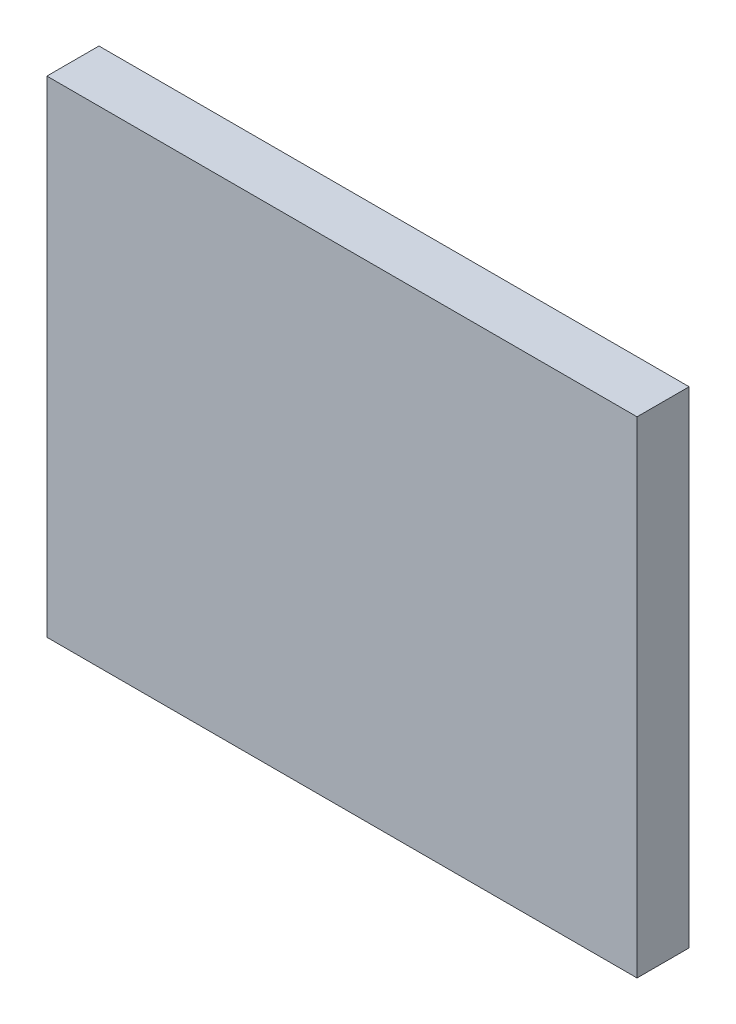
ISO-10303-21;
HEADER;
FILE_DESCRIPTION(('STEP AP214'),'2;1');
FILE_NAME('part.step','',(''),(''),'','','');
FILE_SCHEMA(('AUTOMOTIVE_DESIGN { 1 0 10303 214 1 1 1 1 }'));
ENDSEC;
DATA;
#1=APPLICATION_CONTEXT('core data for automotive mechanical design processes');
#2=APPLICATION_PROTOCOL_DEFINITION('international standard','automotive_design',2000,#1);
#3=PRODUCT_CONTEXT('',#1,'mechanical');
#4=PRODUCT('Part','Part','',(#3));
#5=PRODUCT_RELATED_PRODUCT_CATEGORY('part','',(#4));
#6=PRODUCT_DEFINITION_FORMATION('','',#4);
#7=PRODUCT_DEFINITION_CONTEXT('part definition',#1,'design');
#8=PRODUCT_DEFINITION('design','',#6,#7);
#9=PRODUCT_DEFINITION_SHAPE('','',#8);
#10=(LENGTH_UNIT() NAMED_UNIT(*) SI_UNIT(.MILLI.,.METRE.));
#11=(NAMED_UNIT(*) PLANE_ANGLE_UNIT() SI_UNIT($,.RADIAN.));
#12=(NAMED_UNIT(*) SI_UNIT($,.STERADIAN.) SOLID_ANGLE_UNIT());
#13=UNCERTAINTY_MEASURE_WITH_UNIT(LENGTH_MEASURE(1.E-05),#10,'distance_accuracy_value','');
#14=(GEOMETRIC_REPRESENTATION_CONTEXT(3) GLOBAL_UNCERTAINTY_ASSIGNED_CONTEXT((#13)) GLOBAL_UNIT_ASSIGNED_CONTEXT((#10,
#11,#12)) REPRESENTATION_CONTEXT('',''));
#15=CARTESIAN_POINT('',(0.,0.,0.));
#16=DIRECTION('',(0.,0.,1.));
#17=DIRECTION('',(1.,0.,0.));
#18=AXIS2_PLACEMENT_3D('',#15,#16,#17);
#19=CARTESIAN_POINT('',(10.,-1.4,0.3));
#20=DIRECTION('',(0.,0.,1.));
#21=DIRECTION('',(1.,0.,0.));
#22=AXIS2_PLACEMENT_3D('',#19,#20,#21);
#23=PLANE('',#22);
#24=DIRECTION('',(0.,1.,0.));
#25=VECTOR('',#24,1.);
#26=CARTESIAN_POINT('',(13.4,-1.4,0.3));
#27=LINE('',#26,#25);
#28=CARTESIAN_POINT('',(13.4,1.4,0.3));
#29=VERTEX_POINT('',#28);
#30=CARTESIAN_POINT('',(13.4,-1.4,0.3));
#31=VERTEX_POINT('',#30);
#32=EDGE_CURVE('E76',#29,#31,#27,.F.);
#33=ORIENTED_EDGE('',*,*,#32,.F.);
#34=DIRECTION('',(1.,0.,0.));
#35=VECTOR('',#34,1.);
#36=CARTESIAN_POINT('',(10.,1.4,0.3));
#37=LINE('',#36,#35);
#38=CARTESIAN_POINT('',(10.,1.4,0.3));
#39=VERTEX_POINT('',#38);
#40=EDGE_CURVE('E58',#39,#29,#37,.T.);
#41=ORIENTED_EDGE('',*,*,#40,.F.);
#42=DIRECTION('',(0.,1.,0.));
#43=VECTOR('',#42,1.);
#44=CARTESIAN_POINT('',(10.,-1.4,0.3));
#45=LINE('',#44,#43);
#46=CARTESIAN_POINT('',(10.,-1.4,0.3));
#47=VERTEX_POINT('',#46);
#48=EDGE_CURVE('E20',#39,#47,#45,.F.);
#49=ORIENTED_EDGE('',*,*,#48,.T.);
#50=DIRECTION('',(1.,0.,0.));
#51=VECTOR('',#50,1.);
#52=CARTESIAN_POINT('',(10.,-1.4,0.3));
#53=LINE('',#52,#51);
#54=EDGE_CURVE('E55',#47,#31,#53,.T.);
#55=ORIENTED_EDGE('',*,*,#54,.T.);
#56=EDGE_LOOP('',(#33,#41,#49,#55));
#57=FACE_BOUND('',#56,.T.);
#58=ADVANCED_FACE('F17',(#57),#23,.T.);
#59=CARTESIAN_POINT('',(10.,-1.4,0.));
#60=DIRECTION('',(1.,0.,0.));
#61=DIRECTION('',(0.,0.,-1.));
#62=AXIS2_PLACEMENT_3D('',#59,#60,#61);
#63=PLANE('',#62);
#64=DIRECTION('',(0.,0.,1.));
#65=VECTOR('',#64,1.);
#66=CARTESIAN_POINT('',(10.,1.4,0.));
#67=LINE('',#66,#65);
#68=CARTESIAN_POINT('',(10.,1.4,0.));
#69=VERTEX_POINT('',#68);
#70=EDGE_CURVE('E78',#69,#39,#67,.T.);
#71=ORIENTED_EDGE('',*,*,#70,.F.);
#72=DIRECTION('',(0.,1.,0.));
#73=VECTOR('',#72,1.);
#74=CARTESIAN_POINT('',(10.,-1.4,0.));
#75=LINE('',#74,#73);
#76=CARTESIAN_POINT('',(10.,-1.4,0.));
#77=VERTEX_POINT('',#76);
#78=EDGE_CURVE('E73',#69,#77,#75,.F.);
#79=ORIENTED_EDGE('',*,*,#78,.T.);
#80=DIRECTION('',(0.,0.,1.));
#81=VECTOR('',#80,1.);
#82=CARTESIAN_POINT('',(10.,-1.4,0.));
#83=LINE('',#82,#81);
#84=EDGE_CURVE('E63',#77,#47,#83,.T.);
#85=ORIENTED_EDGE('',*,*,#84,.T.);
#86=ORIENTED_EDGE('',*,*,#48,.F.);
#87=EDGE_LOOP('',(#71,#79,#85,#86));
#88=FACE_BOUND('',#87,.T.);
#89=ADVANCED_FACE('F72',(#88),#63,.F.);
#90=CARTESIAN_POINT('',(10.,-1.4,0.));
#91=DIRECTION('',(0.,1.,0.));
#92=DIRECTION('',(0.,0.,1.));
#93=AXIS2_PLACEMENT_3D('',#90,#91,#92);
#94=PLANE('',#93);
#95=ORIENTED_EDGE('',*,*,#54,.F.);
#96=ORIENTED_EDGE('',*,*,#84,.F.);
#97=DIRECTION('',(1.,0.,0.));
#98=VECTOR('',#97,1.);
#99=CARTESIAN_POINT('',(10.,-1.4,0.));
#100=LINE('',#99,#98);
#101=CARTESIAN_POINT('',(13.4,-1.4,0.));
#102=VERTEX_POINT('',#101);
#103=EDGE_CURVE('E83',#77,#102,#100,.T.);
#104=ORIENTED_EDGE('',*,*,#103,.T.);
#105=DIRECTION('',(0.,0.,-1.));
#106=VECTOR('',#105,1.);
#107=CARTESIAN_POINT('',(13.4,-1.4,0.));
#108=LINE('',#107,#106);
#109=EDGE_CURVE('E69',#31,#102,#108,.T.);
#110=ORIENTED_EDGE('',*,*,#109,.F.);
#111=EDGE_LOOP('',(#95,#96,#104,#110));
#112=FACE_BOUND('',#111,.T.);
#113=ADVANCED_FACE('F66',(#112),#94,.F.);
#114=CARTESIAN_POINT('',(13.4,-1.4,0.));
#115=DIRECTION('',(1.,0.,0.));
#116=DIRECTION('',(0.,0.,-1.));
#117=AXIS2_PLACEMENT_3D('',#114,#115,#116);
#118=PLANE('',#117);
#119=DIRECTION('',(0.,0.,1.));
#120=VECTOR('',#119,1.);
#121=CARTESIAN_POINT('',(13.4,1.4,0.));
#122=LINE('',#121,#120);
#123=CARTESIAN_POINT('',(13.4,1.4,0.));
#124=VERTEX_POINT('',#123);
#125=EDGE_CURVE('E34',#29,#124,#122,.F.);
#126=ORIENTED_EDGE('',*,*,#125,.F.);
#127=ORIENTED_EDGE('',*,*,#32,.T.);
#128=ORIENTED_EDGE('',*,*,#109,.T.);
#129=DIRECTION('',(0.,1.,0.));
#130=VECTOR('',#129,1.);
#131=CARTESIAN_POINT('',(13.4,-1.4,0.));
#132=LINE('',#131,#130);
#133=EDGE_CURVE('E26',#102,#124,#132,.T.);
#134=ORIENTED_EDGE('',*,*,#133,.T.);
#135=EDGE_LOOP('',(#126,#127,#128,#134));
#136=FACE_BOUND('',#135,.T.);
#137=ADVANCED_FACE('F88',(#136),#118,.T.);
#138=CARTESIAN_POINT('',(10.,1.4,0.));
#139=DIRECTION('',(0.,1.,0.));
#140=DIRECTION('',(0.,0.,1.));
#141=AXIS2_PLACEMENT_3D('',#138,#139,#140);
#142=PLANE('',#141);
#143=ORIENTED_EDGE('',*,*,#40,.T.);
#144=ORIENTED_EDGE('',*,*,#125,.T.);
#145=DIRECTION('',(1.,0.,0.));
#146=VECTOR('',#145,1.);
#147=CARTESIAN_POINT('',(10.,1.4,0.));
#148=LINE('',#147,#146);
#149=EDGE_CURVE('E11',#124,#69,#148,.F.);
#150=ORIENTED_EDGE('',*,*,#149,.T.);
#151=ORIENTED_EDGE('',*,*,#70,.T.);
#152=EDGE_LOOP('',(#143,#144,#150,#151));
#153=FACE_BOUND('',#152,.T.);
#154=ADVANCED_FACE('F91',(#153),#142,.T.);
#155=CARTESIAN_POINT('',(10.,-1.4,0.));
#156=DIRECTION('',(0.,0.,1.));
#157=DIRECTION('',(1.,0.,0.));
#158=AXIS2_PLACEMENT_3D('',#155,#156,#157);
#159=PLANE('',#158);
#160=ORIENTED_EDGE('',*,*,#133,.F.);
#161=ORIENTED_EDGE('',*,*,#103,.F.);
#162=ORIENTED_EDGE('',*,*,#78,.F.);
#163=ORIENTED_EDGE('',*,*,#149,.F.);
#164=EDGE_LOOP('',(#160,#161,#162,#163));
#165=FACE_BOUND('',#164,.T.);
#166=ADVANCED_FACE('F90',(#165),#159,.F.);
#167=CLOSED_SHELL('',(#58,#89,#113,#137,#154,#166));
#168=MANIFOLD_SOLID_BREP('B1',#167);
#169=ADVANCED_BREP_SHAPE_REPRESENTATION('',(#18,#168),#14);
#170=SHAPE_DEFINITION_REPRESENTATION(#9,#169);
ENDSEC;
END-ISO-10303-21;
